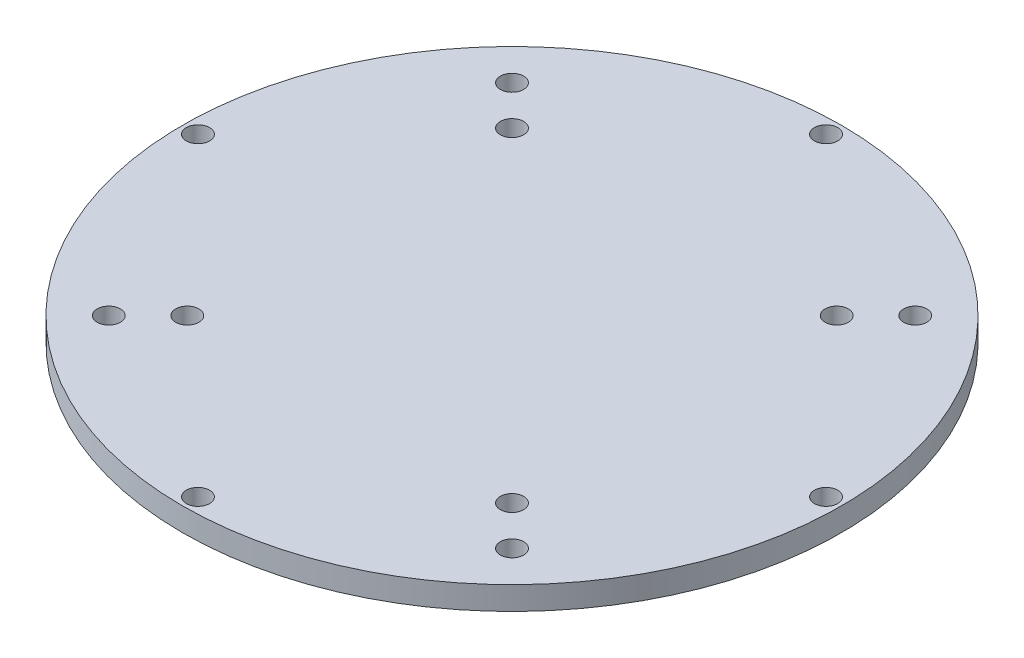
ISO-10303-21;
HEADER;
FILE_DESCRIPTION(('STEP AP214'),'2;1');
FILE_NAME('part.step','',(''),(''),'','','');
FILE_SCHEMA(('AUTOMOTIVE_DESIGN { 1 0 10303 214 1 1 1 1 }'));
ENDSEC;
DATA;
#1=APPLICATION_CONTEXT('core data for automotive mechanical design processes');
#2=APPLICATION_PROTOCOL_DEFINITION('international standard','automotive_design',2000,#1);
#3=PRODUCT_CONTEXT('',#1,'mechanical');
#4=PRODUCT('Part','Part','',(#3));
#5=PRODUCT_RELATED_PRODUCT_CATEGORY('part','',(#4));
#6=PRODUCT_DEFINITION_FORMATION('','',#4);
#7=PRODUCT_DEFINITION_CONTEXT('part definition',#1,'design');
#8=PRODUCT_DEFINITION('design','',#6,#7);
#9=PRODUCT_DEFINITION_SHAPE('','',#8);
#10=(LENGTH_UNIT() NAMED_UNIT(*) SI_UNIT(.MILLI.,.METRE.));
#11=(NAMED_UNIT(*) PLANE_ANGLE_UNIT() SI_UNIT($,.RADIAN.));
#12=(NAMED_UNIT(*) SI_UNIT($,.STERADIAN.) SOLID_ANGLE_UNIT());
#13=UNCERTAINTY_MEASURE_WITH_UNIT(LENGTH_MEASURE(1.E-05),#10,'distance_accuracy_value','');
#14=(GEOMETRIC_REPRESENTATION_CONTEXT(3) GLOBAL_UNCERTAINTY_ASSIGNED_CONTEXT((#13)) GLOBAL_UNIT_ASSIGNED_CONTEXT((#10,
#11,#12)) REPRESENTATION_CONTEXT('',''));
#15=CARTESIAN_POINT('',(0.,0.,0.));
#16=DIRECTION('',(0.,0.,1.));
#17=DIRECTION('',(1.,0.,0.));
#18=AXIS2_PLACEMENT_3D('',#15,#16,#17);
#19=CARTESIAN_POINT('',(0.,3.,0.));
#20=DIRECTION('',(0.,1.,0.));
#21=DIRECTION('',(0.,0.,1.));
#22=AXIS2_PLACEMENT_3D('',#19,#20,#21);
#23=PLANE('',#22);
#24=CARTESIAN_POINT('',(20.9374317909335,3.,20.9374317909338));
#25=DIRECTION('',(0.,1.,0.));
#26=DIRECTION('',(0.,0.,1.));
#27=AXIS2_PLACEMENT_3D('',#24,#25,#26);
#28=CIRCLE('',#27,1.5);
#29=CARTESIAN_POINT('',(20.9374317909335,3.,22.4374317909338));
#30=VERTEX_POINT('',#29);
#31=EDGE_CURVE('E110',#30,#30,#28,.T.);
#32=ORIENTED_EDGE('',*,*,#31,.F.);
#33=EDGE_LOOP('',(#32));
#34=FACE_BOUND('',#33,.T.);
#35=CARTESIAN_POINT('',(-40.5,3.,-4.24214982669441E-13));
#36=DIRECTION('',(0.,1.,0.));
#37=DIRECTION('',(0.,0.,1.));
#38=AXIS2_PLACEMENT_3D('',#35,#36,#37);
#39=CIRCLE('',#38,1.5);
#40=CARTESIAN_POINT('',(-40.5,3.,1.49999999999958));
#41=VERTEX_POINT('',#40);
#42=EDGE_CURVE('E98',#41,#41,#39,.T.);
#43=ORIENTED_EDGE('',*,*,#42,.F.);
#44=EDGE_LOOP('',(#43));
#45=FACE_BOUND('',#44,.T.);
#46=CARTESIAN_POINT('',(-26.0000000000003,3.,25.9999999999997));
#47=DIRECTION('',(0.,1.,0.));
#48=DIRECTION('',(0.,0.,1.));
#49=AXIS2_PLACEMENT_3D('',#46,#47,#48);
#50=CIRCLE('',#49,1.5);
#51=CARTESIAN_POINT('',(-26.0000000000003,3.,27.4999999999997));
#52=VERTEX_POINT('',#51);
#53=EDGE_CURVE('E86',#52,#52,#50,.T.);
#54=ORIENTED_EDGE('',*,*,#53,.F.);
#55=EDGE_LOOP('',(#54));
#56=FACE_BOUND('',#55,.T.);
#57=CARTESIAN_POINT('',(26.0000000000001,3.,-25.9999999999999));
#58=DIRECTION('',(0.,1.,0.));
#59=DIRECTION('',(0.,0.,1.));
#60=AXIS2_PLACEMENT_3D('',#57,#58,#59);
#61=CIRCLE('',#60,1.5);
#62=CARTESIAN_POINT('',(26.0000000000001,3.,-24.4999999999999));
#63=VERTEX_POINT('',#62);
#64=EDGE_CURVE('E74',#63,#63,#61,.T.);
#65=ORIENTED_EDGE('',*,*,#64,.F.);
#66=EDGE_LOOP('',(#65));
#67=FACE_BOUND('',#66,.T.);
#68=CARTESIAN_POINT('',(-26.,3.,-26.));
#69=DIRECTION('',(0.,1.,0.));
#70=DIRECTION('',(0.,0.,1.));
#71=AXIS2_PLACEMENT_3D('',#68,#69,#70);
#72=CIRCLE('',#71,1.5);
#73=CARTESIAN_POINT('',(-26.,3.,-24.5));
#74=VERTEX_POINT('',#73);
#75=EDGE_CURVE('E62',#74,#74,#72,.T.);
#76=ORIENTED_EDGE('',*,*,#75,.F.);
#77=EDGE_LOOP('',(#76));
#78=FACE_BOUND('',#77,.T.);
#79=CARTESIAN_POINT('',(0.,3.,-40.5));
#80=DIRECTION('',(0.,1.,0.));
#81=DIRECTION('',(0.,0.,1.));
#82=AXIS2_PLACEMENT_3D('',#79,#80,#81);
#83=CIRCLE('',#82,1.5);
#84=CARTESIAN_POINT('',(0.,3.,-39.));
#85=VERTEX_POINT('',#84);
#86=EDGE_CURVE('E51',#85,#85,#83,.T.);
#87=ORIENTED_EDGE('',*,*,#86,.F.);
#88=EDGE_LOOP('',(#87));
#89=FACE_BOUND('',#88,.T.);
#90=CARTESIAN_POINT('',(0.,3.,0.));
#91=DIRECTION('',(0.,1.,0.));
#92=DIRECTION('',(0.,0.,1.));
#93=AXIS2_PLACEMENT_3D('',#90,#91,#92);
#94=CIRCLE('',#93,42.5);
#95=CARTESIAN_POINT('',(0.,3.,42.5));
#96=VERTEX_POINT('',#95);
#97=EDGE_CURVE('E10',#96,#96,#94,.T.);
#98=ORIENTED_EDGE('',*,*,#97,.T.);
#99=EDGE_LOOP('',(#98));
#100=FACE_BOUND('',#99,.T.);
#101=CARTESIAN_POINT('',(-20.9374317909337,3.,-20.9374317909337));
#102=DIRECTION('',(0.,1.,0.));
#103=DIRECTION('',(0.,0.,1.));
#104=AXIS2_PLACEMENT_3D('',#101,#102,#103);
#105=CIRCLE('',#104,1.5);
#106=CARTESIAN_POINT('',(-20.9374317909337,3.,-19.4374317909337));
#107=VERTEX_POINT('',#106);
#108=EDGE_CURVE('E56',#107,#107,#105,.T.);
#109=ORIENTED_EDGE('',*,*,#108,.F.);
#110=EDGE_LOOP('',(#109));
#111=FACE_BOUND('',#110,.T.);
#112=CARTESIAN_POINT('',(40.5,3.,1.41404994223147E-13));
#113=DIRECTION('',(0.,1.,0.));
#114=DIRECTION('',(0.,0.,1.));
#115=AXIS2_PLACEMENT_3D('',#112,#113,#114);
#116=CIRCLE('',#115,1.5);
#117=CARTESIAN_POINT('',(40.5,3.,1.50000000000014));
#118=VERTEX_POINT('',#117);
#119=EDGE_CURVE('E68',#118,#118,#116,.T.);
#120=ORIENTED_EDGE('',*,*,#119,.F.);
#121=EDGE_LOOP('',(#120));
#122=FACE_BOUND('',#121,.T.);
#123=CARTESIAN_POINT('',(25.9999999999998,3.,26.0000000000002));
#124=DIRECTION('',(0.,1.,0.));
#125=DIRECTION('',(0.,0.,1.));
#126=AXIS2_PLACEMENT_3D('',#123,#124,#125);
#127=CIRCLE('',#126,1.5);
#128=CARTESIAN_POINT('',(25.9999999999998,3.,27.5000000000002));
#129=VERTEX_POINT('',#128);
#130=EDGE_CURVE('E80',#129,#129,#127,.T.);
#131=ORIENTED_EDGE('',*,*,#130,.F.);
#132=EDGE_LOOP('',(#131));
#133=FACE_BOUND('',#132,.T.);
#134=CARTESIAN_POINT('',(-2.82809988446294E-13,3.,40.5));
#135=DIRECTION('',(0.,1.,0.));
#136=DIRECTION('',(0.,0.,1.));
#137=AXIS2_PLACEMENT_3D('',#134,#135,#136);
#138=CIRCLE('',#137,1.5);
#139=CARTESIAN_POINT('',(-2.82809988446294E-13,3.,42.));
#140=VERTEX_POINT('',#139);
#141=EDGE_CURVE('E92',#140,#140,#138,.T.);
#142=ORIENTED_EDGE('',*,*,#141,.F.);
#143=EDGE_LOOP('',(#142));
#144=FACE_BOUND('',#143,.T.);
#145=CARTESIAN_POINT('',(20.9374317909337,3.,-20.9374317909336));
#146=DIRECTION('',(0.,1.,0.));
#147=DIRECTION('',(0.,0.,1.));
#148=AXIS2_PLACEMENT_3D('',#145,#146,#147);
#149=CIRCLE('',#148,1.5);
#150=CARTESIAN_POINT('',(20.9374317909337,3.,-19.4374317909336));
#151=VERTEX_POINT('',#150);
#152=EDGE_CURVE('E104',#151,#151,#149,.T.);
#153=ORIENTED_EDGE('',*,*,#152,.F.);
#154=EDGE_LOOP('',(#153));
#155=FACE_BOUND('',#154,.T.);
#156=CARTESIAN_POINT('',(-20.9374317909339,3.,20.9374317909335));
#157=DIRECTION('',(0.,1.,0.));
#158=DIRECTION('',(0.,0.,1.));
#159=AXIS2_PLACEMENT_3D('',#156,#157,#158);
#160=CIRCLE('',#159,1.5);
#161=CARTESIAN_POINT('',(-20.9374317909339,3.,22.4374317909335));
#162=VERTEX_POINT('',#161);
#163=EDGE_CURVE('E116',#162,#162,#160,.T.);
#164=ORIENTED_EDGE('',*,*,#163,.F.);
#165=EDGE_LOOP('',(#164));
#166=FACE_BOUND('',#165,.T.);
#167=ADVANCED_FACE('F40',(#34,#45,#56,#67,#78,#89,#100,#111,#122,#133,#144,#155,#166),#23,.T.);
#168=CARTESIAN_POINT('',(0.,0.,0.));
#169=DIRECTION('',(0.,1.,0.));
#170=DIRECTION('',(0.,0.,1.));
#171=AXIS2_PLACEMENT_3D('',#168,#169,#170);
#172=PLANE('',#171);
#173=CARTESIAN_POINT('',(0.,0.,0.));
#174=DIRECTION('',(0.,1.,0.));
#175=DIRECTION('',(0.,0.,1.));
#176=AXIS2_PLACEMENT_3D('',#173,#174,#175);
#177=CIRCLE('',#176,42.5);
#178=CARTESIAN_POINT('',(0.,0.,42.5));
#179=VERTEX_POINT('',#178);
#180=EDGE_CURVE('E44',#179,#179,#177,.T.);
#181=ORIENTED_EDGE('',*,*,#180,.F.);
#182=EDGE_LOOP('',(#181));
#183=FACE_BOUND('',#182,.T.);
#184=CARTESIAN_POINT('',(0.,0.,-40.5));
#185=DIRECTION('',(0.,1.,0.));
#186=DIRECTION('',(0.,0.,1.));
#187=AXIS2_PLACEMENT_3D('',#184,#185,#186);
#188=CIRCLE('',#187,1.5);
#189=CARTESIAN_POINT('',(0.,0.,-39.));
#190=VERTEX_POINT('',#189);
#191=EDGE_CURVE('E53',#190,#190,#188,.T.);
#192=ORIENTED_EDGE('',*,*,#191,.T.);
#193=EDGE_LOOP('',(#192));
#194=FACE_BOUND('',#193,.T.);
#195=CARTESIAN_POINT('',(-20.9374317909337,0.,-20.9374317909337));
#196=DIRECTION('',(0.,1.,0.));
#197=DIRECTION('',(0.,0.,1.));
#198=AXIS2_PLACEMENT_3D('',#195,#196,#197);
#199=CIRCLE('',#198,1.5);
#200=CARTESIAN_POINT('',(-20.9374317909337,0.,-19.4374317909337));
#201=VERTEX_POINT('',#200);
#202=EDGE_CURVE('E59',#201,#201,#199,.T.);
#203=ORIENTED_EDGE('',*,*,#202,.T.);
#204=EDGE_LOOP('',(#203));
#205=FACE_BOUND('',#204,.T.);
#206=CARTESIAN_POINT('',(-26.,0.,-26.));
#207=DIRECTION('',(0.,1.,0.));
#208=DIRECTION('',(0.,0.,1.));
#209=AXIS2_PLACEMENT_3D('',#206,#207,#208);
#210=CIRCLE('',#209,1.5);
#211=CARTESIAN_POINT('',(-26.,0.,-24.5));
#212=VERTEX_POINT('',#211);
#213=EDGE_CURVE('E65',#212,#212,#210,.T.);
#214=ORIENTED_EDGE('',*,*,#213,.T.);
#215=EDGE_LOOP('',(#214));
#216=FACE_BOUND('',#215,.T.);
#217=CARTESIAN_POINT('',(40.5,0.,1.41404994223147E-13));
#218=DIRECTION('',(0.,1.,0.));
#219=DIRECTION('',(0.,0.,1.));
#220=AXIS2_PLACEMENT_3D('',#217,#218,#219);
#221=CIRCLE('',#220,1.5);
#222=CARTESIAN_POINT('',(40.5,0.,1.50000000000014));
#223=VERTEX_POINT('',#222);
#224=EDGE_CURVE('E71',#223,#223,#221,.T.);
#225=ORIENTED_EDGE('',*,*,#224,.T.);
#226=EDGE_LOOP('',(#225));
#227=FACE_BOUND('',#226,.T.);
#228=CARTESIAN_POINT('',(26.0000000000001,0.,-25.9999999999999));
#229=DIRECTION('',(0.,1.,0.));
#230=DIRECTION('',(0.,0.,1.));
#231=AXIS2_PLACEMENT_3D('',#228,#229,#230);
#232=CIRCLE('',#231,1.5);
#233=CARTESIAN_POINT('',(26.0000000000001,0.,-24.4999999999999));
#234=VERTEX_POINT('',#233);
#235=EDGE_CURVE('E77',#234,#234,#232,.T.);
#236=ORIENTED_EDGE('',*,*,#235,.T.);
#237=EDGE_LOOP('',(#236));
#238=FACE_BOUND('',#237,.T.);
#239=CARTESIAN_POINT('',(25.9999999999998,0.,26.0000000000002));
#240=DIRECTION('',(0.,1.,0.));
#241=DIRECTION('',(0.,0.,1.));
#242=AXIS2_PLACEMENT_3D('',#239,#240,#241);
#243=CIRCLE('',#242,1.5);
#244=CARTESIAN_POINT('',(25.9999999999998,0.,27.5000000000002));
#245=VERTEX_POINT('',#244);
#246=EDGE_CURVE('E83',#245,#245,#243,.T.);
#247=ORIENTED_EDGE('',*,*,#246,.T.);
#248=EDGE_LOOP('',(#247));
#249=FACE_BOUND('',#248,.T.);
#250=CARTESIAN_POINT('',(-26.0000000000003,0.,25.9999999999997));
#251=DIRECTION('',(0.,1.,0.));
#252=DIRECTION('',(0.,0.,1.));
#253=AXIS2_PLACEMENT_3D('',#250,#251,#252);
#254=CIRCLE('',#253,1.5);
#255=CARTESIAN_POINT('',(-26.0000000000003,0.,27.4999999999997));
#256=VERTEX_POINT('',#255);
#257=EDGE_CURVE('E89',#256,#256,#254,.T.);
#258=ORIENTED_EDGE('',*,*,#257,.T.);
#259=EDGE_LOOP('',(#258));
#260=FACE_BOUND('',#259,.T.);
#261=CARTESIAN_POINT('',(-2.82809988446294E-13,0.,40.5));
#262=DIRECTION('',(0.,1.,0.));
#263=DIRECTION('',(0.,0.,1.));
#264=AXIS2_PLACEMENT_3D('',#261,#262,#263);
#265=CIRCLE('',#264,1.5);
#266=CARTESIAN_POINT('',(-2.82809988446294E-13,0.,42.));
#267=VERTEX_POINT('',#266);
#268=EDGE_CURVE('E95',#267,#267,#265,.T.);
#269=ORIENTED_EDGE('',*,*,#268,.T.);
#270=EDGE_LOOP('',(#269));
#271=FACE_BOUND('',#270,.T.);
#272=CARTESIAN_POINT('',(-40.5,0.,-4.24214982669441E-13));
#273=DIRECTION('',(0.,1.,0.));
#274=DIRECTION('',(0.,0.,1.));
#275=AXIS2_PLACEMENT_3D('',#272,#273,#274);
#276=CIRCLE('',#275,1.5);
#277=CARTESIAN_POINT('',(-40.5,0.,1.49999999999958));
#278=VERTEX_POINT('',#277);
#279=EDGE_CURVE('E101',#278,#278,#276,.T.);
#280=ORIENTED_EDGE('',*,*,#279,.T.);
#281=EDGE_LOOP('',(#280));
#282=FACE_BOUND('',#281,.T.);
#283=CARTESIAN_POINT('',(20.9374317909337,0.,-20.9374317909336));
#284=DIRECTION('',(0.,1.,0.));
#285=DIRECTION('',(0.,0.,1.));
#286=AXIS2_PLACEMENT_3D('',#283,#284,#285);
#287=CIRCLE('',#286,1.5);
#288=CARTESIAN_POINT('',(20.9374317909337,0.,-19.4374317909336));
#289=VERTEX_POINT('',#288);
#290=EDGE_CURVE('E107',#289,#289,#287,.T.);
#291=ORIENTED_EDGE('',*,*,#290,.T.);
#292=EDGE_LOOP('',(#291));
#293=FACE_BOUND('',#292,.T.);
#294=CARTESIAN_POINT('',(20.9374317909335,0.,20.9374317909338));
#295=DIRECTION('',(0.,1.,0.));
#296=DIRECTION('',(0.,0.,1.));
#297=AXIS2_PLACEMENT_3D('',#294,#295,#296);
#298=CIRCLE('',#297,1.5);
#299=CARTESIAN_POINT('',(20.9374317909335,0.,22.4374317909338));
#300=VERTEX_POINT('',#299);
#301=EDGE_CURVE('E113',#300,#300,#298,.T.);
#302=ORIENTED_EDGE('',*,*,#301,.T.);
#303=EDGE_LOOP('',(#302));
#304=FACE_BOUND('',#303,.T.);
#305=CARTESIAN_POINT('',(-20.9374317909339,0.,20.9374317909335));
#306=DIRECTION('',(0.,1.,0.));
#307=DIRECTION('',(0.,0.,1.));
#308=AXIS2_PLACEMENT_3D('',#305,#306,#307);
#309=CIRCLE('',#308,1.5);
#310=CARTESIAN_POINT('',(-20.9374317909339,0.,22.4374317909335));
#311=VERTEX_POINT('',#310);
#312=EDGE_CURVE('E119',#311,#311,#309,.T.);
#313=ORIENTED_EDGE('',*,*,#312,.T.);
#314=EDGE_LOOP('',(#313));
#315=FACE_BOUND('',#314,.T.);
#316=ADVANCED_FACE('F129',(#183,#194,#205,#216,#227,#238,#249,#260,#271,#282,#293,#304,#315),
#172,.F.);
#317=CARTESIAN_POINT('',(0.,3.,0.));
#318=DIRECTION('',(0.,-1.,0.));
#319=DIRECTION('',(0.,0.,-1.));
#320=AXIS2_PLACEMENT_3D('',#317,#318,#319);
#321=CYLINDRICAL_SURFACE('',#320,42.5);
#322=ORIENTED_EDGE('',*,*,#97,.F.);
#323=EDGE_LOOP('',(#322));
#324=FACE_BOUND('',#323,.T.);
#325=ORIENTED_EDGE('',*,*,#180,.T.);
#326=EDGE_LOOP('',(#325));
#327=FACE_BOUND('',#326,.T.);
#328=ADVANCED_FACE('F42',(#324,#327),#321,.T.);
#329=CARTESIAN_POINT('',(0.,3.,-40.5));
#330=DIRECTION('',(0.,-1.,0.));
#331=DIRECTION('',(0.,0.,-1.));
#332=AXIS2_PLACEMENT_3D('',#329,#330,#331);
#333=CYLINDRICAL_SURFACE('',#332,1.5);
#334=ORIENTED_EDGE('',*,*,#86,.T.);
#335=EDGE_LOOP('',(#334));
#336=FACE_BOUND('',#335,.T.);
#337=ORIENTED_EDGE('',*,*,#191,.F.);
#338=EDGE_LOOP('',(#337));
#339=FACE_BOUND('',#338,.T.);
#340=ADVANCED_FACE('F139',(#336,#339),#333,.F.);
#341=CARTESIAN_POINT('',(-20.9374317909337,3.,-20.9374317909337));
#342=DIRECTION('',(0.,-1.,0.));
#343=DIRECTION('',(0.,0.,-1.));
#344=AXIS2_PLACEMENT_3D('',#341,#342,#343);
#345=CYLINDRICAL_SURFACE('',#344,1.5);
#346=ORIENTED_EDGE('',*,*,#108,.T.);
#347=EDGE_LOOP('',(#346));
#348=FACE_BOUND('',#347,.T.);
#349=ORIENTED_EDGE('',*,*,#202,.F.);
#350=EDGE_LOOP('',(#349));
#351=FACE_BOUND('',#350,.T.);
#352=ADVANCED_FACE('F142',(#348,#351),#345,.F.);
#353=CARTESIAN_POINT('',(-26.,3.,-26.));
#354=DIRECTION('',(0.,-1.,0.));
#355=DIRECTION('',(0.,0.,-1.));
#356=AXIS2_PLACEMENT_3D('',#353,#354,#355);
#357=CYLINDRICAL_SURFACE('',#356,1.5);
#358=ORIENTED_EDGE('',*,*,#75,.T.);
#359=EDGE_LOOP('',(#358));
#360=FACE_BOUND('',#359,.T.);
#361=ORIENTED_EDGE('',*,*,#213,.F.);
#362=EDGE_LOOP('',(#361));
#363=FACE_BOUND('',#362,.T.);
#364=ADVANCED_FACE('F146',(#360,#363),#357,.F.);
#365=CARTESIAN_POINT('',(40.5,3.,1.41404994223147E-13));
#366=DIRECTION('',(0.,-1.,0.));
#367=DIRECTION('',(0.,0.,-1.));
#368=AXIS2_PLACEMENT_3D('',#365,#366,#367);
#369=CYLINDRICAL_SURFACE('',#368,1.5);
#370=ORIENTED_EDGE('',*,*,#119,.T.);
#371=EDGE_LOOP('',(#370));
#372=FACE_BOUND('',#371,.T.);
#373=ORIENTED_EDGE('',*,*,#224,.F.);
#374=EDGE_LOOP('',(#373));
#375=FACE_BOUND('',#374,.T.);
#376=ADVANCED_FACE('F150',(#372,#375),#369,.F.);
#377=CARTESIAN_POINT('',(26.0000000000001,3.,-25.9999999999999));
#378=DIRECTION('',(0.,-1.,0.));
#379=DIRECTION('',(0.,0.,-1.));
#380=AXIS2_PLACEMENT_3D('',#377,#378,#379);
#381=CYLINDRICAL_SURFACE('',#380,1.5);
#382=ORIENTED_EDGE('',*,*,#64,.T.);
#383=EDGE_LOOP('',(#382));
#384=FACE_BOUND('',#383,.T.);
#385=ORIENTED_EDGE('',*,*,#235,.F.);
#386=EDGE_LOOP('',(#385));
#387=FACE_BOUND('',#386,.T.);
#388=ADVANCED_FACE('F154',(#384,#387),#381,.F.);
#389=CARTESIAN_POINT('',(25.9999999999998,3.,26.0000000000002));
#390=DIRECTION('',(0.,-1.,0.));
#391=DIRECTION('',(0.,0.,-1.));
#392=AXIS2_PLACEMENT_3D('',#389,#390,#391);
#393=CYLINDRICAL_SURFACE('',#392,1.5);
#394=ORIENTED_EDGE('',*,*,#130,.T.);
#395=EDGE_LOOP('',(#394));
#396=FACE_BOUND('',#395,.T.);
#397=ORIENTED_EDGE('',*,*,#246,.F.);
#398=EDGE_LOOP('',(#397));
#399=FACE_BOUND('',#398,.T.);
#400=ADVANCED_FACE('F158',(#396,#399),#393,.F.);
#401=CARTESIAN_POINT('',(-26.0000000000003,3.,25.9999999999997));
#402=DIRECTION('',(0.,-1.,0.));
#403=DIRECTION('',(0.,0.,-1.));
#404=AXIS2_PLACEMENT_3D('',#401,#402,#403);
#405=CYLINDRICAL_SURFACE('',#404,1.5);
#406=ORIENTED_EDGE('',*,*,#53,.T.);
#407=EDGE_LOOP('',(#406));
#408=FACE_BOUND('',#407,.T.);
#409=ORIENTED_EDGE('',*,*,#257,.F.);
#410=EDGE_LOOP('',(#409));
#411=FACE_BOUND('',#410,.T.);
#412=ADVANCED_FACE('F162',(#408,#411),#405,.F.);
#413=CARTESIAN_POINT('',(-2.82809988446294E-13,3.,40.5));
#414=DIRECTION('',(0.,-1.,0.));
#415=DIRECTION('',(0.,0.,-1.));
#416=AXIS2_PLACEMENT_3D('',#413,#414,#415);
#417=CYLINDRICAL_SURFACE('',#416,1.5);
#418=ORIENTED_EDGE('',*,*,#141,.T.);
#419=EDGE_LOOP('',(#418));
#420=FACE_BOUND('',#419,.T.);
#421=ORIENTED_EDGE('',*,*,#268,.F.);
#422=EDGE_LOOP('',(#421));
#423=FACE_BOUND('',#422,.T.);
#424=ADVANCED_FACE('F166',(#420,#423),#417,.F.);
#425=CARTESIAN_POINT('',(-40.5,3.,-4.24214982669441E-13));
#426=DIRECTION('',(0.,-1.,0.));
#427=DIRECTION('',(0.,0.,-1.));
#428=AXIS2_PLACEMENT_3D('',#425,#426,#427);
#429=CYLINDRICAL_SURFACE('',#428,1.5);
#430=ORIENTED_EDGE('',*,*,#42,.T.);
#431=EDGE_LOOP('',(#430));
#432=FACE_BOUND('',#431,.T.);
#433=ORIENTED_EDGE('',*,*,#279,.F.);
#434=EDGE_LOOP('',(#433));
#435=FACE_BOUND('',#434,.T.);
#436=ADVANCED_FACE('F170',(#432,#435),#429,.F.);
#437=CARTESIAN_POINT('',(20.9374317909337,3.,-20.9374317909336));
#438=DIRECTION('',(0.,-1.,0.));
#439=DIRECTION('',(0.,0.,-1.));
#440=AXIS2_PLACEMENT_3D('',#437,#438,#439);
#441=CYLINDRICAL_SURFACE('',#440,1.5);
#442=ORIENTED_EDGE('',*,*,#152,.T.);
#443=EDGE_LOOP('',(#442));
#444=FACE_BOUND('',#443,.T.);
#445=ORIENTED_EDGE('',*,*,#290,.F.);
#446=EDGE_LOOP('',(#445));
#447=FACE_BOUND('',#446,.T.);
#448=ADVANCED_FACE('F174',(#444,#447),#441,.F.);
#449=CARTESIAN_POINT('',(20.9374317909335,3.,20.9374317909338));
#450=DIRECTION('',(0.,-1.,0.));
#451=DIRECTION('',(0.,0.,-1.));
#452=AXIS2_PLACEMENT_3D('',#449,#450,#451);
#453=CYLINDRICAL_SURFACE('',#452,1.5);
#454=ORIENTED_EDGE('',*,*,#31,.T.);
#455=EDGE_LOOP('',(#454));
#456=FACE_BOUND('',#455,.T.);
#457=ORIENTED_EDGE('',*,*,#301,.F.);
#458=EDGE_LOOP('',(#457));
#459=FACE_BOUND('',#458,.T.);
#460=ADVANCED_FACE('F178',(#456,#459),#453,.F.);
#461=CARTESIAN_POINT('',(-20.9374317909339,3.,20.9374317909335));
#462=DIRECTION('',(0.,-1.,0.));
#463=DIRECTION('',(0.,0.,-1.));
#464=AXIS2_PLACEMENT_3D('',#461,#462,#463);
#465=CYLINDRICAL_SURFACE('',#464,1.5);
#466=ORIENTED_EDGE('',*,*,#163,.T.);
#467=EDGE_LOOP('',(#466));
#468=FACE_BOUND('',#467,.T.);
#469=ORIENTED_EDGE('',*,*,#312,.F.);
#470=EDGE_LOOP('',(#469));
#471=FACE_BOUND('',#470,.T.);
#472=ADVANCED_FACE('F125',(#468,#471),#465,.F.);
#473=CLOSED_SHELL('',(#167,#316,#328,#340,#352,#364,#376,#388,#400,#412,#424,#436,#448,#460,#472));
#474=MANIFOLD_SOLID_BREP('B2',#473);
#475=ADVANCED_BREP_SHAPE_REPRESENTATION('',(#18,#474),#14);
#476=SHAPE_DEFINITION_REPRESENTATION(#9,#475);
ENDSEC;
END-ISO-10303-21;
